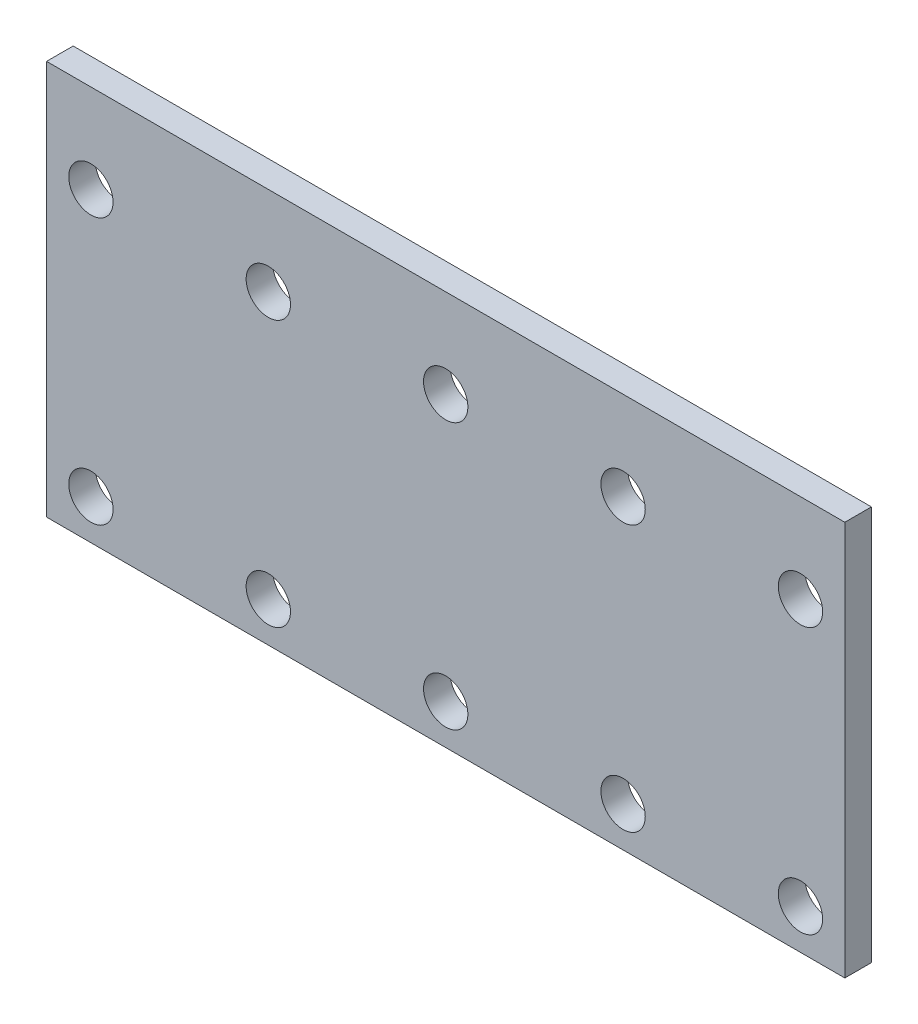
ISO-10303-21;
HEADER;
FILE_DESCRIPTION(('STEP AP214'),'2;1');
FILE_NAME('part.step','',(''),(''),'','','');
FILE_SCHEMA(('AUTOMOTIVE_DESIGN { 1 0 10303 214 1 1 1 1 }'));
ENDSEC;
DATA;
#1=APPLICATION_CONTEXT('core data for automotive mechanical design processes');
#2=APPLICATION_PROTOCOL_DEFINITION('international standard','automotive_design',2000,#1);
#3=PRODUCT_CONTEXT('',#1,'mechanical');
#4=PRODUCT('Part','Part','',(#3));
#5=PRODUCT_RELATED_PRODUCT_CATEGORY('part','',(#4));
#6=PRODUCT_DEFINITION_FORMATION('','',#4);
#7=PRODUCT_DEFINITION_CONTEXT('part definition',#1,'design');
#8=PRODUCT_DEFINITION('design','',#6,#7);
#9=PRODUCT_DEFINITION_SHAPE('','',#8);
#10=(LENGTH_UNIT() NAMED_UNIT(*) SI_UNIT(.MILLI.,.METRE.));
#11=(NAMED_UNIT(*) PLANE_ANGLE_UNIT() SI_UNIT($,.RADIAN.));
#12=(NAMED_UNIT(*) SI_UNIT($,.STERADIAN.) SOLID_ANGLE_UNIT());
#13=UNCERTAINTY_MEASURE_WITH_UNIT(LENGTH_MEASURE(1.E-05),#10,'distance_accuracy_value','');
#14=(GEOMETRIC_REPRESENTATION_CONTEXT(3) GLOBAL_UNCERTAINTY_ASSIGNED_CONTEXT((#13)) GLOBAL_UNIT_ASSIGNED_CONTEXT((#10,
#11,#12)) REPRESENTATION_CONTEXT('',''));
#15=CARTESIAN_POINT('',(0.,0.,0.));
#16=DIRECTION('',(0.,0.,1.));
#17=DIRECTION('',(1.,0.,0.));
#18=AXIS2_PLACEMENT_3D('',#15,#16,#17);
#19=CARTESIAN_POINT('',(0.,0.,3.));
#20=DIRECTION('',(0.,1.,0.));
#21=DIRECTION('',(0.,0.,1.));
#22=AXIS2_PLACEMENT_3D('',#19,#20,#21);
#23=PLANE('',#22);
#24=DIRECTION('',(1.,0.,0.));
#25=VECTOR('',#24,1.);
#26=CARTESIAN_POINT('',(0.,0.,0.));
#27=LINE('',#26,#25);
#28=CARTESIAN_POINT('',(0.,0.,0.));
#29=VERTEX_POINT('',#28);
#30=CARTESIAN_POINT('',(90.,0.,0.));
#31=VERTEX_POINT('',#30);
#32=EDGE_CURVE('E130',#29,#31,#27,.T.);
#33=ORIENTED_EDGE('',*,*,#32,.T.);
#34=DIRECTION('',(0.,0.,-1.));
#35=VECTOR('',#34,1.);
#36=CARTESIAN_POINT('',(90.,0.,3.));
#37=LINE('',#36,#35);
#38=CARTESIAN_POINT('',(90.,0.,3.));
#39=VERTEX_POINT('',#38);
#40=EDGE_CURVE('E11',#39,#31,#37,.T.);
#41=ORIENTED_EDGE('',*,*,#40,.F.);
#42=DIRECTION('',(1.,0.,0.));
#43=VECTOR('',#42,1.);
#44=CARTESIAN_POINT('',(0.,0.,3.));
#45=LINE('',#44,#43);
#46=CARTESIAN_POINT('',(0.,0.,3.));
#47=VERTEX_POINT('',#46);
#48=EDGE_CURVE('E86',#47,#39,#45,.T.);
#49=ORIENTED_EDGE('',*,*,#48,.F.);
#50=DIRECTION('',(0.,0.,-1.));
#51=VECTOR('',#50,1.);
#52=CARTESIAN_POINT('',(0.,0.,3.));
#53=LINE('',#52,#51);
#54=EDGE_CURVE('E52',#47,#29,#53,.T.);
#55=ORIENTED_EDGE('',*,*,#54,.T.);
#56=EDGE_LOOP('',(#33,#41,#49,#55));
#57=FACE_BOUND('',#56,.T.);
#58=ADVANCED_FACE('F35',(#57),#23,.F.);
#59=CARTESIAN_POINT('',(90.,0.,3.));
#60=DIRECTION('',(-1.,0.,0.));
#61=DIRECTION('',(0.,0.,1.));
#62=AXIS2_PLACEMENT_3D('',#59,#60,#61);
#63=PLANE('',#62);
#64=DIRECTION('',(0.,1.,0.));
#65=VECTOR('',#64,1.);
#66=CARTESIAN_POINT('',(90.,0.,0.));
#67=LINE('',#66,#65);
#68=CARTESIAN_POINT('',(90.,44.5,0.));
#69=VERTEX_POINT('',#68);
#70=EDGE_CURVE('E91',#31,#69,#67,.T.);
#71=ORIENTED_EDGE('',*,*,#70,.T.);
#72=DIRECTION('',(0.,0.,-1.));
#73=VECTOR('',#72,1.);
#74=CARTESIAN_POINT('',(90.,44.5,3.));
#75=LINE('',#74,#73);
#76=CARTESIAN_POINT('',(90.,44.5,3.));
#77=VERTEX_POINT('',#76);
#78=EDGE_CURVE('E44',#77,#69,#75,.T.);
#79=ORIENTED_EDGE('',*,*,#78,.F.);
#80=DIRECTION('',(0.,1.,0.));
#81=VECTOR('',#80,1.);
#82=CARTESIAN_POINT('',(90.,0.,3.));
#83=LINE('',#82,#81);
#84=EDGE_CURVE('E77',#39,#77,#83,.T.);
#85=ORIENTED_EDGE('',*,*,#84,.F.);
#86=ORIENTED_EDGE('',*,*,#40,.T.);
#87=EDGE_LOOP('',(#71,#79,#85,#86));
#88=FACE_BOUND('',#87,.T.);
#89=ADVANCED_FACE('F90',(#88),#63,.F.);
#90=CARTESIAN_POINT('',(0.,44.5,3.));
#91=DIRECTION('',(0.,1.,0.));
#92=DIRECTION('',(0.,0.,1.));
#93=AXIS2_PLACEMENT_3D('',#90,#91,#92);
#94=PLANE('',#93);
#95=DIRECTION('',(1.,0.,0.));
#96=VECTOR('',#95,1.);
#97=CARTESIAN_POINT('',(0.,44.5,0.));
#98=LINE('',#97,#96);
#99=CARTESIAN_POINT('',(0.,44.5,0.));
#100=VERTEX_POINT('',#99);
#101=EDGE_CURVE('E133',#100,#69,#98,.T.);
#102=ORIENTED_EDGE('',*,*,#101,.F.);
#103=DIRECTION('',(0.,0.,-1.));
#104=VECTOR('',#103,1.);
#105=CARTESIAN_POINT('',(0.,44.5,3.));
#106=LINE('',#105,#104);
#107=CARTESIAN_POINT('',(0.,44.5,3.));
#108=VERTEX_POINT('',#107);
#109=EDGE_CURVE('E66',#108,#100,#106,.T.);
#110=ORIENTED_EDGE('',*,*,#109,.F.);
#111=DIRECTION('',(1.,0.,0.));
#112=VECTOR('',#111,1.);
#113=CARTESIAN_POINT('',(0.,44.5,3.));
#114=LINE('',#113,#112);
#115=EDGE_CURVE('E85',#108,#77,#114,.T.);
#116=ORIENTED_EDGE('',*,*,#115,.T.);
#117=ORIENTED_EDGE('',*,*,#78,.T.);
#118=EDGE_LOOP('',(#102,#110,#116,#117));
#119=FACE_BOUND('',#118,.T.);
#120=ADVANCED_FACE('F94',(#119),#94,.T.);
#121=CARTESIAN_POINT('',(25.,34.5,3.));
#122=DIRECTION('',(0.,0.,-1.));
#123=DIRECTION('',(-1.,0.,0.));
#124=AXIS2_PLACEMENT_3D('',#121,#122,#123);
#125=CYLINDRICAL_SURFACE('',#124,2.5);
#126=CARTESIAN_POINT('',(25.,34.5,3.));
#127=DIRECTION('',(0.,0.,1.));
#128=DIRECTION('',(1.,0.,0.));
#129=AXIS2_PLACEMENT_3D('',#126,#127,#128);
#130=CIRCLE('',#129,2.5);
#131=CARTESIAN_POINT('',(27.5,34.5,3.));
#132=VERTEX_POINT('',#131);
#133=EDGE_CURVE('E109',#132,#132,#130,.T.);
#134=ORIENTED_EDGE('',*,*,#133,.T.);
#135=EDGE_LOOP('',(#134));
#136=FACE_BOUND('',#135,.T.);
#137=CARTESIAN_POINT('',(25.,34.5,0.));
#138=DIRECTION('',(0.,0.,1.));
#139=DIRECTION('',(1.,0.,0.));
#140=AXIS2_PLACEMENT_3D('',#137,#138,#139);
#141=CIRCLE('',#140,2.5);
#142=CARTESIAN_POINT('',(27.5,34.5,0.));
#143=VERTEX_POINT('',#142);
#144=EDGE_CURVE('E147',#143,#143,#141,.T.);
#145=ORIENTED_EDGE('',*,*,#144,.F.);
#146=EDGE_LOOP('',(#145));
#147=FACE_BOUND('',#146,.T.);
#148=ADVANCED_FACE('F236',(#136,#147),#125,.F.);
#149=CARTESIAN_POINT('',(45.,34.5,3.));
#150=DIRECTION('',(0.,0.,-1.));
#151=DIRECTION('',(-1.,0.,0.));
#152=AXIS2_PLACEMENT_3D('',#149,#150,#151);
#153=CYLINDRICAL_SURFACE('',#152,2.5);
#154=CARTESIAN_POINT('',(45.,34.5,3.));
#155=DIRECTION('',(0.,0.,1.));
#156=DIRECTION('',(1.,0.,0.));
#157=AXIS2_PLACEMENT_3D('',#154,#155,#156);
#158=CIRCLE('',#157,2.5);
#159=CARTESIAN_POINT('',(47.5,34.5,3.));
#160=VERTEX_POINT('',#159);
#161=EDGE_CURVE('E106',#160,#160,#158,.T.);
#162=ORIENTED_EDGE('',*,*,#161,.T.);
#163=EDGE_LOOP('',(#162));
#164=FACE_BOUND('',#163,.T.);
#165=CARTESIAN_POINT('',(45.,34.5,0.));
#166=DIRECTION('',(0.,0.,1.));
#167=DIRECTION('',(1.,0.,0.));
#168=AXIS2_PLACEMENT_3D('',#165,#166,#167);
#169=CIRCLE('',#168,2.5);
#170=CARTESIAN_POINT('',(47.5,34.5,0.));
#171=VERTEX_POINT('',#170);
#172=EDGE_CURVE('E144',#171,#171,#169,.T.);
#173=ORIENTED_EDGE('',*,*,#172,.F.);
#174=EDGE_LOOP('',(#173));
#175=FACE_BOUND('',#174,.T.);
#176=ADVANCED_FACE('F238',(#164,#175),#153,.F.);
#177=CARTESIAN_POINT('',(65.,34.5,3.));
#178=DIRECTION('',(0.,0.,-1.));
#179=DIRECTION('',(-1.,0.,0.));
#180=AXIS2_PLACEMENT_3D('',#177,#178,#179);
#181=CYLINDRICAL_SURFACE('',#180,2.50000000000001);
#182=CARTESIAN_POINT('',(65.,34.5,3.));
#183=DIRECTION('',(0.,0.,1.));
#184=DIRECTION('',(1.,0.,0.));
#185=AXIS2_PLACEMENT_3D('',#182,#183,#184);
#186=CIRCLE('',#185,2.50000000000001);
#187=CARTESIAN_POINT('',(67.5,34.5,3.));
#188=VERTEX_POINT('',#187);
#189=EDGE_CURVE('E103',#188,#188,#186,.T.);
#190=ORIENTED_EDGE('',*,*,#189,.T.);
#191=EDGE_LOOP('',(#190));
#192=FACE_BOUND('',#191,.T.);
#193=CARTESIAN_POINT('',(65.,34.5,0.));
#194=DIRECTION('',(0.,0.,1.));
#195=DIRECTION('',(1.,0.,0.));
#196=AXIS2_PLACEMENT_3D('',#193,#194,#195);
#197=CIRCLE('',#196,2.50000000000001);
#198=CARTESIAN_POINT('',(67.5,34.5,0.));
#199=VERTEX_POINT('',#198);
#200=EDGE_CURVE('E141',#199,#199,#197,.T.);
#201=ORIENTED_EDGE('',*,*,#200,.F.);
#202=EDGE_LOOP('',(#201));
#203=FACE_BOUND('',#202,.T.);
#204=ADVANCED_FACE('F245',(#192,#203),#181,.F.);
#205=CARTESIAN_POINT('',(85.,34.5,3.));
#206=DIRECTION('',(0.,0.,-1.));
#207=DIRECTION('',(-1.,0.,0.));
#208=AXIS2_PLACEMENT_3D('',#205,#206,#207);
#209=CYLINDRICAL_SURFACE('',#208,2.50000000000001);
#210=CARTESIAN_POINT('',(85.,34.5,3.));
#211=DIRECTION('',(0.,0.,1.));
#212=DIRECTION('',(1.,0.,0.));
#213=AXIS2_PLACEMENT_3D('',#210,#211,#212);
#214=CIRCLE('',#213,2.50000000000001);
#215=CARTESIAN_POINT('',(87.5,34.5,3.));
#216=VERTEX_POINT('',#215);
#217=EDGE_CURVE('E97',#216,#216,#214,.T.);
#218=ORIENTED_EDGE('',*,*,#217,.T.);
#219=EDGE_LOOP('',(#218));
#220=FACE_BOUND('',#219,.T.);
#221=CARTESIAN_POINT('',(85.,34.5,0.));
#222=DIRECTION('',(0.,0.,1.));
#223=DIRECTION('',(1.,0.,0.));
#224=AXIS2_PLACEMENT_3D('',#221,#222,#223);
#225=CIRCLE('',#224,2.50000000000001);
#226=CARTESIAN_POINT('',(87.5,34.5,0.));
#227=VERTEX_POINT('',#226);
#228=EDGE_CURVE('E138',#227,#227,#225,.T.);
#229=ORIENTED_EDGE('',*,*,#228,.F.);
#230=EDGE_LOOP('',(#229));
#231=FACE_BOUND('',#230,.T.);
#232=ADVANCED_FACE('F251',(#220,#231),#209,.F.);
#233=CARTESIAN_POINT('',(0.,0.,3.));
#234=DIRECTION('',(-1.,0.,0.));
#235=DIRECTION('',(0.,0.,1.));
#236=AXIS2_PLACEMENT_3D('',#233,#234,#235);
#237=PLANE('',#236);
#238=DIRECTION('',(0.,1.,0.));
#239=VECTOR('',#238,1.);
#240=CARTESIAN_POINT('',(0.,0.,0.));
#241=LINE('',#240,#239);
#242=EDGE_CURVE('E135',#29,#100,#241,.T.);
#243=ORIENTED_EDGE('',*,*,#242,.F.);
#244=ORIENTED_EDGE('',*,*,#54,.F.);
#245=DIRECTION('',(0.,1.,0.));
#246=VECTOR('',#245,1.);
#247=CARTESIAN_POINT('',(0.,0.,3.));
#248=LINE('',#247,#246);
#249=EDGE_CURVE('E95',#47,#108,#248,.T.);
#250=ORIENTED_EDGE('',*,*,#249,.T.);
#251=ORIENTED_EDGE('',*,*,#109,.T.);
#252=EDGE_LOOP('',(#243,#244,#250,#251));
#253=FACE_BOUND('',#252,.T.);
#254=ADVANCED_FACE('F203',(#253),#237,.T.);
#255=CARTESIAN_POINT('',(5.,4.5,3.));
#256=DIRECTION('',(0.,0.,-1.));
#257=DIRECTION('',(-1.,0.,0.));
#258=AXIS2_PLACEMENT_3D('',#255,#256,#257);
#259=CYLINDRICAL_SURFACE('',#258,2.5);
#260=CARTESIAN_POINT('',(5.,4.5,3.));
#261=DIRECTION('',(0.,0.,1.));
#262=DIRECTION('',(1.,0.,0.));
#263=AXIS2_PLACEMENT_3D('',#260,#261,#262);
#264=CIRCLE('',#263,2.5);
#265=CARTESIAN_POINT('',(7.5,4.5,3.));
#266=VERTEX_POINT('',#265);
#267=EDGE_CURVE('E171',#266,#266,#264,.T.);
#268=ORIENTED_EDGE('',*,*,#267,.T.);
#269=EDGE_LOOP('',(#268));
#270=FACE_BOUND('',#269,.T.);
#271=CARTESIAN_POINT('',(5.,4.5,0.));
#272=DIRECTION('',(0.,0.,1.));
#273=DIRECTION('',(1.,0.,0.));
#274=AXIS2_PLACEMENT_3D('',#271,#272,#273);
#275=CIRCLE('',#274,2.5);
#276=CARTESIAN_POINT('',(7.5,4.5,0.));
#277=VERTEX_POINT('',#276);
#278=EDGE_CURVE('E127',#277,#277,#275,.T.);
#279=ORIENTED_EDGE('',*,*,#278,.F.);
#280=EDGE_LOOP('',(#279));
#281=FACE_BOUND('',#280,.T.);
#282=ADVANCED_FACE('F175',(#270,#281),#259,.F.);
#283=CARTESIAN_POINT('',(25.,4.5,3.));
#284=DIRECTION('',(0.,0.,-1.));
#285=DIRECTION('',(-1.,0.,0.));
#286=AXIS2_PLACEMENT_3D('',#283,#284,#285);
#287=CYLINDRICAL_SURFACE('',#286,2.5);
#288=CARTESIAN_POINT('',(25.,4.5,3.));
#289=DIRECTION('',(0.,0.,1.));
#290=DIRECTION('',(1.,0.,0.));
#291=AXIS2_PLACEMENT_3D('',#288,#289,#290);
#292=CIRCLE('',#291,2.5);
#293=CARTESIAN_POINT('',(27.5,4.5,3.));
#294=VERTEX_POINT('',#293);
#295=EDGE_CURVE('E168',#294,#294,#292,.T.);
#296=ORIENTED_EDGE('',*,*,#295,.T.);
#297=EDGE_LOOP('',(#296));
#298=FACE_BOUND('',#297,.T.);
#299=CARTESIAN_POINT('',(25.,4.5,0.));
#300=DIRECTION('',(0.,0.,1.));
#301=DIRECTION('',(1.,0.,0.));
#302=AXIS2_PLACEMENT_3D('',#299,#300,#301);
#303=CIRCLE('',#302,2.5);
#304=CARTESIAN_POINT('',(27.5,4.5,0.));
#305=VERTEX_POINT('',#304);
#306=EDGE_CURVE('E124',#305,#305,#303,.T.);
#307=ORIENTED_EDGE('',*,*,#306,.F.);
#308=EDGE_LOOP('',(#307));
#309=FACE_BOUND('',#308,.T.);
#310=ADVANCED_FACE('F202',(#298,#309),#287,.F.);
#311=CARTESIAN_POINT('',(45.,4.5,3.));
#312=DIRECTION('',(0.,0.,-1.));
#313=DIRECTION('',(-1.,0.,0.));
#314=AXIS2_PLACEMENT_3D('',#311,#312,#313);
#315=CYLINDRICAL_SURFACE('',#314,2.5);
#316=CARTESIAN_POINT('',(45.,4.5,3.));
#317=DIRECTION('',(0.,0.,1.));
#318=DIRECTION('',(1.,0.,0.));
#319=AXIS2_PLACEMENT_3D('',#316,#317,#318);
#320=CIRCLE('',#319,2.5);
#321=CARTESIAN_POINT('',(47.5,4.5,3.));
#322=VERTEX_POINT('',#321);
#323=EDGE_CURVE('E163',#322,#322,#320,.T.);
#324=ORIENTED_EDGE('',*,*,#323,.T.);
#325=EDGE_LOOP('',(#324));
#326=FACE_BOUND('',#325,.T.);
#327=CARTESIAN_POINT('',(45.,4.5,0.));
#328=DIRECTION('',(0.,0.,1.));
#329=DIRECTION('',(1.,0.,0.));
#330=AXIS2_PLACEMENT_3D('',#327,#328,#329);
#331=CIRCLE('',#330,2.5);
#332=CARTESIAN_POINT('',(47.5,4.5,0.));
#333=VERTEX_POINT('',#332);
#334=EDGE_CURVE('E121',#333,#333,#331,.T.);
#335=ORIENTED_EDGE('',*,*,#334,.F.);
#336=EDGE_LOOP('',(#335));
#337=FACE_BOUND('',#336,.T.);
#338=ADVANCED_FACE('F206',(#326,#337),#315,.F.);
#339=CARTESIAN_POINT('',(65.,4.5,3.));
#340=DIRECTION('',(0.,0.,-1.));
#341=DIRECTION('',(-1.,0.,0.));
#342=AXIS2_PLACEMENT_3D('',#339,#340,#341);
#343=CYLINDRICAL_SURFACE('',#342,2.5);
#344=CARTESIAN_POINT('',(65.,4.5,3.));
#345=DIRECTION('',(0.,0.,1.));
#346=DIRECTION('',(1.,0.,0.));
#347=AXIS2_PLACEMENT_3D('',#344,#345,#346);
#348=CIRCLE('',#347,2.5);
#349=CARTESIAN_POINT('',(67.5,4.5,3.));
#350=VERTEX_POINT('',#349);
#351=EDGE_CURVE('E158',#350,#350,#348,.T.);
#352=ORIENTED_EDGE('',*,*,#351,.T.);
#353=EDGE_LOOP('',(#352));
#354=FACE_BOUND('',#353,.T.);
#355=CARTESIAN_POINT('',(65.,4.5,0.));
#356=DIRECTION('',(0.,0.,1.));
#357=DIRECTION('',(1.,0.,0.));
#358=AXIS2_PLACEMENT_3D('',#355,#356,#357);
#359=CIRCLE('',#358,2.5);
#360=CARTESIAN_POINT('',(67.5,4.5,0.));
#361=VERTEX_POINT('',#360);
#362=EDGE_CURVE('E118',#361,#361,#359,.T.);
#363=ORIENTED_EDGE('',*,*,#362,.F.);
#364=EDGE_LOOP('',(#363));
#365=FACE_BOUND('',#364,.T.);
#366=ADVANCED_FACE('F209',(#354,#365),#343,.F.);
#367=CARTESIAN_POINT('',(85.,4.5,3.));
#368=DIRECTION('',(0.,0.,-1.));
#369=DIRECTION('',(-1.,0.,0.));
#370=AXIS2_PLACEMENT_3D('',#367,#368,#369);
#371=CYLINDRICAL_SURFACE('',#370,2.5);
#372=CARTESIAN_POINT('',(85.,4.5,3.));
#373=DIRECTION('',(0.,0.,1.));
#374=DIRECTION('',(1.,0.,0.));
#375=AXIS2_PLACEMENT_3D('',#372,#373,#374);
#376=CIRCLE('',#375,2.5);
#377=CARTESIAN_POINT('',(87.5,4.5,3.));
#378=VERTEX_POINT('',#377);
#379=EDGE_CURVE('E153',#378,#378,#376,.T.);
#380=ORIENTED_EDGE('',*,*,#379,.T.);
#381=EDGE_LOOP('',(#380));
#382=FACE_BOUND('',#381,.T.);
#383=CARTESIAN_POINT('',(85.,4.5,0.));
#384=DIRECTION('',(0.,0.,1.));
#385=DIRECTION('',(1.,0.,0.));
#386=AXIS2_PLACEMENT_3D('',#383,#384,#385);
#387=CIRCLE('',#386,2.5);
#388=CARTESIAN_POINT('',(87.5,4.5,0.));
#389=VERTEX_POINT('',#388);
#390=EDGE_CURVE('E115',#389,#389,#387,.T.);
#391=ORIENTED_EDGE('',*,*,#390,.F.);
#392=EDGE_LOOP('',(#391));
#393=FACE_BOUND('',#392,.T.);
#394=ADVANCED_FACE('F37',(#382,#393),#371,.F.);
#395=CARTESIAN_POINT('',(4.99999999999999,34.5,3.));
#396=DIRECTION('',(0.,0.,-1.));
#397=DIRECTION('',(-1.,0.,0.));
#398=AXIS2_PLACEMENT_3D('',#395,#396,#397);
#399=CYLINDRICAL_SURFACE('',#398,2.5);
#400=CARTESIAN_POINT('',(4.99999999999999,34.5,3.));
#401=DIRECTION('',(0.,0.,1.));
#402=DIRECTION('',(1.,0.,0.));
#403=AXIS2_PLACEMENT_3D('',#400,#401,#402);
#404=CIRCLE('',#403,2.5);
#405=CARTESIAN_POINT('',(7.5,34.5,3.));
#406=VERTEX_POINT('',#405);
#407=EDGE_CURVE('E112',#406,#406,#404,.T.);
#408=ORIENTED_EDGE('',*,*,#407,.T.);
#409=EDGE_LOOP('',(#408));
#410=FACE_BOUND('',#409,.T.);
#411=CARTESIAN_POINT('',(4.99999999999999,34.5,0.));
#412=DIRECTION('',(0.,0.,1.));
#413=DIRECTION('',(1.,0.,0.));
#414=AXIS2_PLACEMENT_3D('',#411,#412,#413);
#415=CIRCLE('',#414,2.5);
#416=CARTESIAN_POINT('',(7.5,34.5,0.));
#417=VERTEX_POINT('',#416);
#418=EDGE_CURVE('E150',#417,#417,#415,.T.);
#419=ORIENTED_EDGE('',*,*,#418,.F.);
#420=EDGE_LOOP('',(#419));
#421=FACE_BOUND('',#420,.T.);
#422=ADVANCED_FACE('F180',(#410,#421),#399,.F.);
#423=CARTESIAN_POINT('',(0.,0.,3.));
#424=DIRECTION('',(0.,0.,1.));
#425=DIRECTION('',(1.,0.,0.));
#426=AXIS2_PLACEMENT_3D('',#423,#424,#425);
#427=PLANE('',#426);
#428=ORIENTED_EDGE('',*,*,#379,.F.);
#429=EDGE_LOOP('',(#428));
#430=FACE_BOUND('',#429,.T.);
#431=ORIENTED_EDGE('',*,*,#351,.F.);
#432=EDGE_LOOP('',(#431));
#433=FACE_BOUND('',#432,.T.);
#434=ORIENTED_EDGE('',*,*,#323,.F.);
#435=EDGE_LOOP('',(#434));
#436=FACE_BOUND('',#435,.T.);
#437=ORIENTED_EDGE('',*,*,#295,.F.);
#438=EDGE_LOOP('',(#437));
#439=FACE_BOUND('',#438,.T.);
#440=ORIENTED_EDGE('',*,*,#267,.F.);
#441=EDGE_LOOP('',(#440));
#442=FACE_BOUND('',#441,.T.);
#443=ORIENTED_EDGE('',*,*,#48,.T.);
#444=ORIENTED_EDGE('',*,*,#84,.T.);
#445=ORIENTED_EDGE('',*,*,#115,.F.);
#446=ORIENTED_EDGE('',*,*,#249,.F.);
#447=EDGE_LOOP('',(#443,#444,#445,#446));
#448=FACE_BOUND('',#447,.T.);
#449=ORIENTED_EDGE('',*,*,#217,.F.);
#450=EDGE_LOOP('',(#449));
#451=FACE_BOUND('',#450,.T.);
#452=ORIENTED_EDGE('',*,*,#189,.F.);
#453=EDGE_LOOP('',(#452));
#454=FACE_BOUND('',#453,.T.);
#455=ORIENTED_EDGE('',*,*,#161,.F.);
#456=EDGE_LOOP('',(#455));
#457=FACE_BOUND('',#456,.T.);
#458=ORIENTED_EDGE('',*,*,#133,.F.);
#459=EDGE_LOOP('',(#458));
#460=FACE_BOUND('',#459,.T.);
#461=ORIENTED_EDGE('',*,*,#407,.F.);
#462=EDGE_LOOP('',(#461));
#463=FACE_BOUND('',#462,.T.);
#464=ADVANCED_FACE('F81',(#430,#433,#436,#439,#442,#448,#451,#454,#457,#460,#463),#427,.T.);
#465=CARTESIAN_POINT('',(0.,0.,0.));
#466=DIRECTION('',(0.,0.,1.));
#467=DIRECTION('',(1.,0.,0.));
#468=AXIS2_PLACEMENT_3D('',#465,#466,#467);
#469=PLANE('',#468);
#470=ORIENTED_EDGE('',*,*,#390,.T.);
#471=EDGE_LOOP('',(#470));
#472=FACE_BOUND('',#471,.T.);
#473=ORIENTED_EDGE('',*,*,#362,.T.);
#474=EDGE_LOOP('',(#473));
#475=FACE_BOUND('',#474,.T.);
#476=ORIENTED_EDGE('',*,*,#334,.T.);
#477=EDGE_LOOP('',(#476));
#478=FACE_BOUND('',#477,.T.);
#479=ORIENTED_EDGE('',*,*,#306,.T.);
#480=EDGE_LOOP('',(#479));
#481=FACE_BOUND('',#480,.T.);
#482=ORIENTED_EDGE('',*,*,#278,.T.);
#483=EDGE_LOOP('',(#482));
#484=FACE_BOUND('',#483,.T.);
#485=ORIENTED_EDGE('',*,*,#32,.F.);
#486=ORIENTED_EDGE('',*,*,#242,.T.);
#487=ORIENTED_EDGE('',*,*,#101,.T.);
#488=ORIENTED_EDGE('',*,*,#70,.F.);
#489=EDGE_LOOP('',(#485,#486,#487,#488));
#490=FACE_BOUND('',#489,.T.);
#491=ORIENTED_EDGE('',*,*,#228,.T.);
#492=EDGE_LOOP('',(#491));
#493=FACE_BOUND('',#492,.T.);
#494=ORIENTED_EDGE('',*,*,#200,.T.);
#495=EDGE_LOOP('',(#494));
#496=FACE_BOUND('',#495,.T.);
#497=ORIENTED_EDGE('',*,*,#172,.T.);
#498=EDGE_LOOP('',(#497));
#499=FACE_BOUND('',#498,.T.);
#500=ORIENTED_EDGE('',*,*,#144,.T.);
#501=EDGE_LOOP('',(#500));
#502=FACE_BOUND('',#501,.T.);
#503=ORIENTED_EDGE('',*,*,#418,.T.);
#504=EDGE_LOOP('',(#503));
#505=FACE_BOUND('',#504,.T.);
#506=ADVANCED_FACE('F179',(#472,#475,#478,#481,#484,#490,#493,#496,#499,#502,#505),#469,.F.);
#507=CLOSED_SHELL('',(#58,#89,#120,#148,#176,#204,#232,#254,#282,#310,#338,#366,#394,#422,#464,#506));
#508=MANIFOLD_SOLID_BREP('B2',#507);
#509=ADVANCED_BREP_SHAPE_REPRESENTATION('',(#18,#508),#14);
#510=SHAPE_DEFINITION_REPRESENTATION(#9,#509);
ENDSEC;
END-ISO-10303-21;
